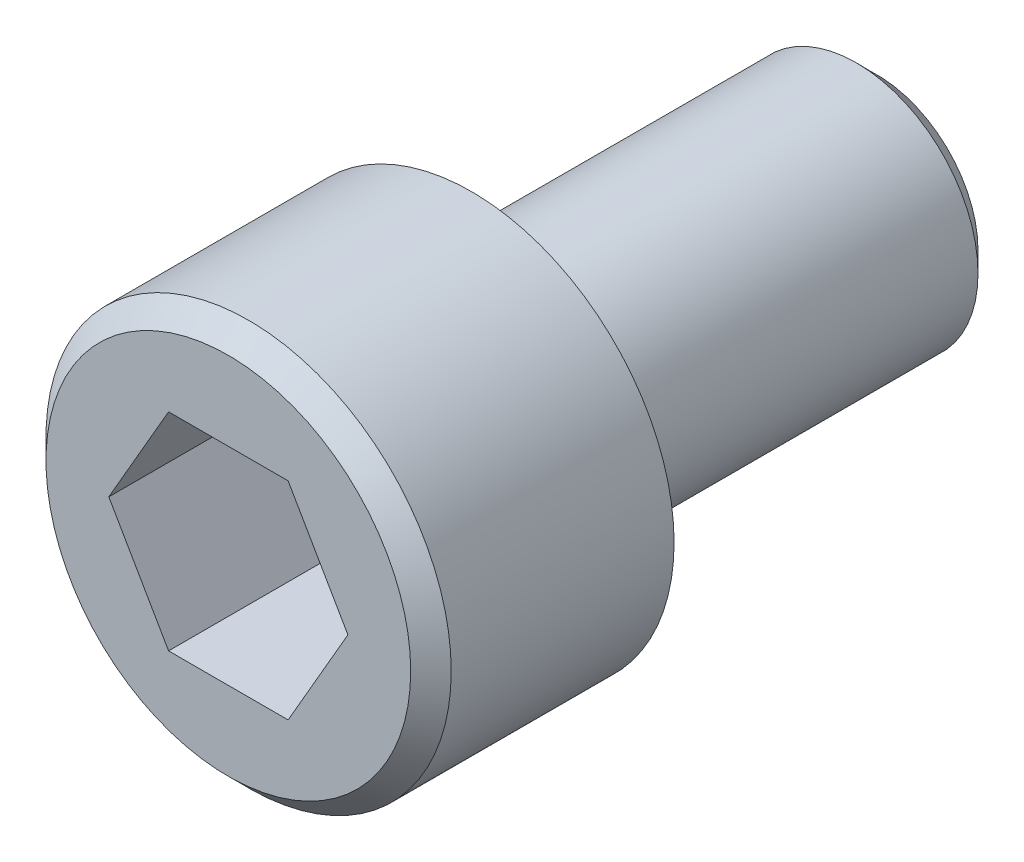
ISO-10303-21;
HEADER;
FILE_DESCRIPTION(('STEP AP214'),'2;1');
FILE_NAME('part.step','',(''),(''),'','','');
FILE_SCHEMA(('AUTOMOTIVE_DESIGN { 1 0 10303 214 1 1 1 1 }'));
ENDSEC;
DATA;
#1=APPLICATION_CONTEXT('core data for automotive mechanical design processes');
#2=APPLICATION_PROTOCOL_DEFINITION('international standard','automotive_design',2000,#1);
#3=PRODUCT_CONTEXT('',#1,'mechanical');
#4=PRODUCT('Part','Part','',(#3));
#5=PRODUCT_RELATED_PRODUCT_CATEGORY('part','',(#4));
#6=PRODUCT_DEFINITION_FORMATION('','',#4);
#7=PRODUCT_DEFINITION_CONTEXT('part definition',#1,'design');
#8=PRODUCT_DEFINITION('design','',#6,#7);
#9=PRODUCT_DEFINITION_SHAPE('','',#8);
#10=(LENGTH_UNIT() NAMED_UNIT(*) SI_UNIT(.MILLI.,.METRE.));
#11=(NAMED_UNIT(*) PLANE_ANGLE_UNIT() SI_UNIT($,.RADIAN.));
#12=(NAMED_UNIT(*) SI_UNIT($,.STERADIAN.) SOLID_ANGLE_UNIT());
#13=UNCERTAINTY_MEASURE_WITH_UNIT(LENGTH_MEASURE(1.E-05),#10,'distance_accuracy_value','');
#14=(GEOMETRIC_REPRESENTATION_CONTEXT(3) GLOBAL_UNCERTAINTY_ASSIGNED_CONTEXT((#13)) GLOBAL_UNIT_ASSIGNED_CONTEXT((#10,
#11,#12)) REPRESENTATION_CONTEXT('',''));
#15=CARTESIAN_POINT('',(0.,0.,0.));
#16=DIRECTION('',(0.,0.,1.));
#17=DIRECTION('',(1.,0.,0.));
#18=AXIS2_PLACEMENT_3D('',#15,#16,#17);
#19=CARTESIAN_POINT('',(0.,0.,0.));
#20=DIRECTION('',(0.,0.,1.));
#21=DIRECTION('',(1.,0.,0.));
#22=AXIS2_PLACEMENT_3D('',#19,#20,#21);
#23=PLANE('',#22);
#24=CARTESIAN_POINT('',(0.,0.,0.));
#25=DIRECTION('',(0.,0.,1.));
#26=DIRECTION('',(1.,0.,0.));
#27=AXIS2_PLACEMENT_3D('',#24,#25,#26);
#28=CIRCLE('',#27,5.);
#29=CARTESIAN_POINT('',(5.,0.,0.));
#30=VERTEX_POINT('',#29);
#31=EDGE_CURVE('E134',#30,#30,#28,.T.);
#32=ORIENTED_EDGE('',*,*,#31,.F.);
#33=EDGE_LOOP('',(#32));
#34=FACE_BOUND('',#33,.T.);
#35=CARTESIAN_POINT('',(0.,0.,0.));
#36=DIRECTION('',(0.,0.,1.));
#37=DIRECTION('',(1.,0.,0.));
#38=AXIS2_PLACEMENT_3D('',#35,#36,#37);
#39=CIRCLE('',#38,3.);
#40=CARTESIAN_POINT('',(3.,0.,0.));
#41=VERTEX_POINT('',#40);
#42=EDGE_CURVE('E142',#41,#41,#39,.F.);
#43=ORIENTED_EDGE('',*,*,#42,.F.);
#44=EDGE_LOOP('',(#43));
#45=FACE_BOUND('',#44,.T.);
#46=ADVANCED_FACE('F32',(#34,#45),#23,.F.);
#47=CARTESIAN_POINT('',(0.,0.,6.));
#48=DIRECTION('',(0.,0.,-1.));
#49=DIRECTION('',(-1.,0.,0.));
#50=AXIS2_PLACEMENT_3D('',#47,#48,#49);
#51=CYLINDRICAL_SURFACE('',#50,5.);
#52=CARTESIAN_POINT('',(0.,0.,5.5));
#53=DIRECTION('',(0.,0.,1.));
#54=DIRECTION('',(1.,0.,0.));
#55=AXIS2_PLACEMENT_3D('',#52,#53,#54);
#56=CIRCLE('',#55,5.);
#57=CARTESIAN_POINT('',(5.,0.,5.5));
#58=VERTEX_POINT('',#57);
#59=EDGE_CURVE('E148',#58,#58,#56,.F.);
#60=ORIENTED_EDGE('',*,*,#59,.T.);
#61=EDGE_LOOP('',(#60));
#62=FACE_BOUND('',#61,.T.);
#63=ORIENTED_EDGE('',*,*,#31,.T.);
#64=EDGE_LOOP('',(#63));
#65=FACE_BOUND('',#64,.T.);
#66=ADVANCED_FACE('F168',(#62,#65),#51,.T.);
#67=CARTESIAN_POINT('',(0.,0.,6.));
#68=DIRECTION('',(0.,0.,1.));
#69=DIRECTION('',(1.,0.,0.));
#70=AXIS2_PLACEMENT_3D('',#67,#68,#69);
#71=PLANE('',#70);
#72=DIRECTION('',(0.5,0.866025403784439,0.));
#73=VECTOR('',#72,1.);
#74=CARTESIAN_POINT('',(1.475,-2.5547749411641,6.));
#75=LINE('',#74,#73);
#76=CARTESIAN_POINT('',(1.475,-2.5547749411641,6.));
#77=VERTEX_POINT('',#76);
#78=CARTESIAN_POINT('',(2.95,0.,6.));
#79=VERTEX_POINT('',#78);
#80=EDGE_CURVE('E47',#77,#79,#75,.T.);
#81=ORIENTED_EDGE('',*,*,#80,.F.);
#82=DIRECTION('',(1.,0.,0.));
#83=VECTOR('',#82,1.);
#84=CARTESIAN_POINT('',(-1.475,-2.5547749411641,6.));
#85=LINE('',#84,#83);
#86=CARTESIAN_POINT('',(-1.475,-2.5547749411641,6.));
#87=VERTEX_POINT('',#86);
#88=EDGE_CURVE('E130',#87,#77,#85,.T.);
#89=ORIENTED_EDGE('',*,*,#88,.F.);
#90=DIRECTION('',(0.5,-0.866025403784438,0.));
#91=VECTOR('',#90,1.);
#92=CARTESIAN_POINT('',(-2.95,0.,6.));
#93=LINE('',#92,#91);
#94=CARTESIAN_POINT('',(-2.95,0.,6.));
#95=VERTEX_POINT('',#94);
#96=EDGE_CURVE('E128',#95,#87,#93,.T.);
#97=ORIENTED_EDGE('',*,*,#96,.F.);
#98=DIRECTION('',(-0.5,-0.866025403784439,0.));
#99=VECTOR('',#98,1.);
#100=CARTESIAN_POINT('',(-1.475,2.5547749411641,6.));
#101=LINE('',#100,#99);
#102=CARTESIAN_POINT('',(-1.475,2.5547749411641,6.));
#103=VERTEX_POINT('',#102);
#104=EDGE_CURVE('E95',#103,#95,#101,.T.);
#105=ORIENTED_EDGE('',*,*,#104,.F.);
#106=DIRECTION('',(-1.,0.,0.));
#107=VECTOR('',#106,1.);
#108=CARTESIAN_POINT('',(1.475,2.5547749411641,6.));
#109=LINE('',#108,#107);
#110=CARTESIAN_POINT('',(1.475,2.5547749411641,6.));
#111=VERTEX_POINT('',#110);
#112=EDGE_CURVE('E124',#111,#103,#109,.T.);
#113=ORIENTED_EDGE('',*,*,#112,.F.);
#114=DIRECTION('',(-0.5,0.866025403784439,0.));
#115=VECTOR('',#114,1.);
#116=CARTESIAN_POINT('',(2.95,0.,6.));
#117=LINE('',#116,#115);
#118=EDGE_CURVE('E121',#79,#111,#117,.T.);
#119=ORIENTED_EDGE('',*,*,#118,.F.);
#120=EDGE_LOOP('',(#81,#89,#97,#105,#113,#119));
#121=FACE_BOUND('',#120,.T.);
#122=CARTESIAN_POINT('',(0.,0.,6.));
#123=DIRECTION('',(0.,0.,1.));
#124=DIRECTION('',(1.,0.,0.));
#125=AXIS2_PLACEMENT_3D('',#122,#123,#124);
#126=CIRCLE('',#125,4.5);
#127=CARTESIAN_POINT('',(4.5,0.,6.));
#128=VERTEX_POINT('',#127);
#129=EDGE_CURVE('E145',#128,#128,#126,.T.);
#130=ORIENTED_EDGE('',*,*,#129,.T.);
#131=EDGE_LOOP('',(#130));
#132=FACE_BOUND('',#131,.T.);
#133=ADVANCED_FACE('F174',(#121,#132),#71,.T.);
#134=CARTESIAN_POINT('',(0.,0.,-10.));
#135=DIRECTION('',(0.,0.,1.));
#136=DIRECTION('',(1.,0.,0.));
#137=AXIS2_PLACEMENT_3D('',#134,#135,#136);
#138=CYLINDRICAL_SURFACE('',#137,3.);
#139=CARTESIAN_POINT('',(0.,0.,-9.5));
#140=DIRECTION('',(0.,0.,-1.));
#141=DIRECTION('',(-1.,0.,0.));
#142=AXIS2_PLACEMENT_3D('',#139,#140,#141);
#143=CIRCLE('',#142,3.);
#144=CARTESIAN_POINT('',(-3.,0.,-9.5));
#145=VERTEX_POINT('',#144);
#146=EDGE_CURVE('E11',#145,#145,#143,.F.);
#147=ORIENTED_EDGE('',*,*,#146,.T.);
#148=EDGE_LOOP('',(#147));
#149=FACE_BOUND('',#148,.T.);
#150=ORIENTED_EDGE('',*,*,#42,.T.);
#151=EDGE_LOOP('',(#150));
#152=FACE_BOUND('',#151,.T.);
#153=ADVANCED_FACE('F182',(#149,#152),#138,.T.);
#154=CARTESIAN_POINT('',(0.,0.,-10.));
#155=DIRECTION('',(0.,0.,-1.));
#156=DIRECTION('',(-1.,0.,0.));
#157=AXIS2_PLACEMENT_3D('',#154,#155,#156);
#158=PLANE('',#157);
#159=CARTESIAN_POINT('',(0.,0.,-10.));
#160=DIRECTION('',(0.,0.,-1.));
#161=DIRECTION('',(-1.,0.,0.));
#162=AXIS2_PLACEMENT_3D('',#159,#160,#161);
#163=CIRCLE('',#162,2.5);
#164=CARTESIAN_POINT('',(-2.5,0.,-10.));
#165=VERTEX_POINT('',#164);
#166=EDGE_CURVE('E40',#165,#165,#163,.T.);
#167=ORIENTED_EDGE('',*,*,#166,.T.);
#168=EDGE_LOOP('',(#167));
#169=FACE_BOUND('',#168,.T.);
#170=ADVANCED_FACE('F153',(#169),#158,.T.);
#171=CARTESIAN_POINT('',(0.,0.,6.));
#172=DIRECTION('',(0.,0.,-1.));
#173=DIRECTION('',(-1.,0.,0.));
#174=AXIS2_PLACEMENT_3D('',#171,#172,#173);
#175=CONICAL_SURFACE('',#174,4.5,0.785398163397446);
#176=ORIENTED_EDGE('',*,*,#59,.F.);
#177=EDGE_LOOP('',(#176));
#178=FACE_BOUND('',#177,.T.);
#179=ORIENTED_EDGE('',*,*,#129,.F.);
#180=EDGE_LOOP('',(#179));
#181=FACE_BOUND('',#180,.T.);
#182=ADVANCED_FACE('F157',(#178,#181),#175,.T.);
#183=CARTESIAN_POINT('',(0.,0.,-10.));
#184=DIRECTION('',(0.,0.,1.));
#185=DIRECTION('',(1.,0.,0.));
#186=AXIS2_PLACEMENT_3D('',#183,#184,#185);
#187=CONICAL_SURFACE('',#186,2.5,0.785398163397444);
#188=ORIENTED_EDGE('',*,*,#146,.F.);
#189=EDGE_LOOP('',(#188));
#190=FACE_BOUND('',#189,.T.);
#191=ORIENTED_EDGE('',*,*,#166,.F.);
#192=EDGE_LOOP('',(#191));
#193=FACE_BOUND('',#192,.T.);
#194=ADVANCED_FACE('F34',(#190,#193),#187,.T.);
#195=CARTESIAN_POINT('',(1.475,-2.5547749411641,2.));
#196=DIRECTION('',(0.866025403784439,-0.5,0.));
#197=DIRECTION('',(0.5,0.866025403784439,0.));
#198=AXIS2_PLACEMENT_3D('',#195,#196,#197);
#199=PLANE('',#198);
#200=ORIENTED_EDGE('',*,*,#80,.T.);
#201=DIRECTION('',(0.,0.,1.));
#202=VECTOR('',#201,1.);
#203=CARTESIAN_POINT('',(2.95,0.,2.));
#204=LINE('',#203,#202);
#205=CARTESIAN_POINT('',(2.95,0.,2.));
#206=VERTEX_POINT('',#205);
#207=EDGE_CURVE('E77',#206,#79,#204,.T.);
#208=ORIENTED_EDGE('',*,*,#207,.F.);
#209=DIRECTION('',(0.5,0.866025403784439,0.));
#210=VECTOR('',#209,1.);
#211=CARTESIAN_POINT('',(1.475,-2.5547749411641,2.));
#212=LINE('',#211,#210);
#213=CARTESIAN_POINT('',(1.475,-2.5547749411641,2.));
#214=VERTEX_POINT('',#213);
#215=EDGE_CURVE('E132',#214,#206,#212,.T.);
#216=ORIENTED_EDGE('',*,*,#215,.F.);
#217=DIRECTION('',(0.,0.,1.));
#218=VECTOR('',#217,1.);
#219=CARTESIAN_POINT('',(1.475,-2.5547749411641,2.));
#220=LINE('',#219,#218);
#221=EDGE_CURVE('E55',#214,#77,#220,.T.);
#222=ORIENTED_EDGE('',*,*,#221,.T.);
#223=EDGE_LOOP('',(#200,#208,#216,#222));
#224=FACE_BOUND('',#223,.T.);
#225=ADVANCED_FACE('F156',(#224),#199,.F.);
#226=CARTESIAN_POINT('',(-1.475,-2.5547749411641,2.));
#227=DIRECTION('',(0.,-1.,0.));
#228=DIRECTION('',(1.,0.,0.));
#229=AXIS2_PLACEMENT_3D('',#226,#227,#228);
#230=PLANE('',#229);
#231=ORIENTED_EDGE('',*,*,#88,.T.);
#232=ORIENTED_EDGE('',*,*,#221,.F.);
#233=DIRECTION('',(1.,0.,0.));
#234=VECTOR('',#233,1.);
#235=CARTESIAN_POINT('',(-1.475,-2.5547749411641,2.));
#236=LINE('',#235,#234);
#237=CARTESIAN_POINT('',(-1.475,-2.5547749411641,2.));
#238=VERTEX_POINT('',#237);
#239=EDGE_CURVE('E107',#238,#214,#236,.T.);
#240=ORIENTED_EDGE('',*,*,#239,.F.);
#241=DIRECTION('',(0.,0.,1.));
#242=VECTOR('',#241,1.);
#243=CARTESIAN_POINT('',(-1.475,-2.5547749411641,2.));
#244=LINE('',#243,#242);
#245=EDGE_CURVE('E99',#238,#87,#244,.T.);
#246=ORIENTED_EDGE('',*,*,#245,.T.);
#247=EDGE_LOOP('',(#231,#232,#240,#246));
#248=FACE_BOUND('',#247,.T.);
#249=ADVANCED_FACE('F163',(#248),#230,.F.);
#250=CARTESIAN_POINT('',(-2.95,0.,2.));
#251=DIRECTION('',(-0.866025403784439,-0.5,0.));
#252=DIRECTION('',(0.5,-0.866025403784438,0.));
#253=AXIS2_PLACEMENT_3D('',#250,#251,#252);
#254=PLANE('',#253);
#255=ORIENTED_EDGE('',*,*,#96,.T.);
#256=ORIENTED_EDGE('',*,*,#245,.F.);
#257=DIRECTION('',(0.5,-0.866025403784438,0.));
#258=VECTOR('',#257,1.);
#259=CARTESIAN_POINT('',(-2.95,0.,2.));
#260=LINE('',#259,#258);
#261=CARTESIAN_POINT('',(-2.95,0.,2.));
#262=VERTEX_POINT('',#261);
#263=EDGE_CURVE('E103',#262,#238,#260,.T.);
#264=ORIENTED_EDGE('',*,*,#263,.F.);
#265=DIRECTION('',(0.,0.,1.));
#266=VECTOR('',#265,1.);
#267=CARTESIAN_POINT('',(-2.95,0.,2.));
#268=LINE('',#267,#266);
#269=EDGE_CURVE('E88',#262,#95,#268,.T.);
#270=ORIENTED_EDGE('',*,*,#269,.T.);
#271=EDGE_LOOP('',(#255,#256,#264,#270));
#272=FACE_BOUND('',#271,.T.);
#273=ADVANCED_FACE('F104',(#272),#254,.F.);
#274=CARTESIAN_POINT('',(-1.475,2.5547749411641,2.));
#275=DIRECTION('',(-0.866025403784439,0.5,0.));
#276=DIRECTION('',(-0.5,-0.866025403784439,0.));
#277=AXIS2_PLACEMENT_3D('',#274,#275,#276);
#278=PLANE('',#277);
#279=ORIENTED_EDGE('',*,*,#104,.T.);
#280=ORIENTED_EDGE('',*,*,#269,.F.);
#281=DIRECTION('',(-0.5,-0.866025403784439,0.));
#282=VECTOR('',#281,1.);
#283=CARTESIAN_POINT('',(-1.475,2.5547749411641,2.));
#284=LINE('',#283,#282);
#285=CARTESIAN_POINT('',(-1.475,2.5547749411641,2.));
#286=VERTEX_POINT('',#285);
#287=EDGE_CURVE('E92',#286,#262,#284,.T.);
#288=ORIENTED_EDGE('',*,*,#287,.F.);
#289=DIRECTION('',(0.,0.,1.));
#290=VECTOR('',#289,1.);
#291=CARTESIAN_POINT('',(-1.475,2.5547749411641,2.));
#292=LINE('',#291,#290);
#293=EDGE_CURVE('E100',#286,#103,#292,.T.);
#294=ORIENTED_EDGE('',*,*,#293,.T.);
#295=EDGE_LOOP('',(#279,#280,#288,#294));
#296=FACE_BOUND('',#295,.T.);
#297=ADVANCED_FACE('F90',(#296),#278,.F.);
#298=CARTESIAN_POINT('',(1.475,2.5547749411641,2.));
#299=DIRECTION('',(0.,1.,0.));
#300=DIRECTION('',(0.,0.,1.));
#301=AXIS2_PLACEMENT_3D('',#298,#299,#300);
#302=PLANE('',#301);
#303=ORIENTED_EDGE('',*,*,#112,.T.);
#304=ORIENTED_EDGE('',*,*,#293,.F.);
#305=DIRECTION('',(-1.,0.,0.));
#306=VECTOR('',#305,1.);
#307=CARTESIAN_POINT('',(1.475,2.5547749411641,2.));
#308=LINE('',#307,#306);
#309=CARTESIAN_POINT('',(1.475,2.5547749411641,2.));
#310=VERTEX_POINT('',#309);
#311=EDGE_CURVE('E113',#310,#286,#308,.T.);
#312=ORIENTED_EDGE('',*,*,#311,.F.);
#313=DIRECTION('',(0.,0.,1.));
#314=VECTOR('',#313,1.);
#315=CARTESIAN_POINT('',(1.475,2.5547749411641,2.));
#316=LINE('',#315,#314);
#317=EDGE_CURVE('E137',#310,#111,#316,.T.);
#318=ORIENTED_EDGE('',*,*,#317,.T.);
#319=EDGE_LOOP('',(#303,#304,#312,#318));
#320=FACE_BOUND('',#319,.T.);
#321=ADVANCED_FACE('F192',(#320),#302,.F.);
#322=CARTESIAN_POINT('',(2.95,0.,2.));
#323=DIRECTION('',(0.866025403784439,0.5,0.));
#324=DIRECTION('',(-0.5,0.866025403784439,0.));
#325=AXIS2_PLACEMENT_3D('',#322,#323,#324);
#326=PLANE('',#325);
#327=ORIENTED_EDGE('',*,*,#118,.T.);
#328=ORIENTED_EDGE('',*,*,#317,.F.);
#329=DIRECTION('',(-0.5,0.866025403784439,0.));
#330=VECTOR('',#329,1.);
#331=CARTESIAN_POINT('',(2.95,0.,2.));
#332=LINE('',#331,#330);
#333=EDGE_CURVE('E115',#206,#310,#332,.T.);
#334=ORIENTED_EDGE('',*,*,#333,.F.);
#335=ORIENTED_EDGE('',*,*,#207,.T.);
#336=EDGE_LOOP('',(#327,#328,#334,#335));
#337=FACE_BOUND('',#336,.T.);
#338=ADVANCED_FACE('F189',(#337),#326,.F.);
#339=CARTESIAN_POINT('',(0.,0.,2.));
#340=DIRECTION('',(0.,0.,1.));
#341=DIRECTION('',(1.,0.,0.));
#342=AXIS2_PLACEMENT_3D('',#339,#340,#341);
#343=PLANE('',#342);
#344=ORIENTED_EDGE('',*,*,#215,.T.);
#345=ORIENTED_EDGE('',*,*,#333,.T.);
#346=ORIENTED_EDGE('',*,*,#311,.T.);
#347=ORIENTED_EDGE('',*,*,#287,.T.);
#348=ORIENTED_EDGE('',*,*,#263,.T.);
#349=ORIENTED_EDGE('',*,*,#239,.T.);
#350=EDGE_LOOP('',(#344,#345,#346,#347,#348,#349));
#351=FACE_BOUND('',#350,.T.);
#352=ADVANCED_FACE('F110',(#351),#343,.T.);
#353=CLOSED_SHELL('',(#46,#66,#133,#153,#170,#182,#194,#225,#249,#273,#297,#321,#338,#352));
#354=MANIFOLD_SOLID_BREP('B2',#353);
#355=ADVANCED_BREP_SHAPE_REPRESENTATION('',(#18,#354),#14);
#356=SHAPE_DEFINITION_REPRESENTATION(#9,#355);
ENDSEC;
END-ISO-10303-21;
